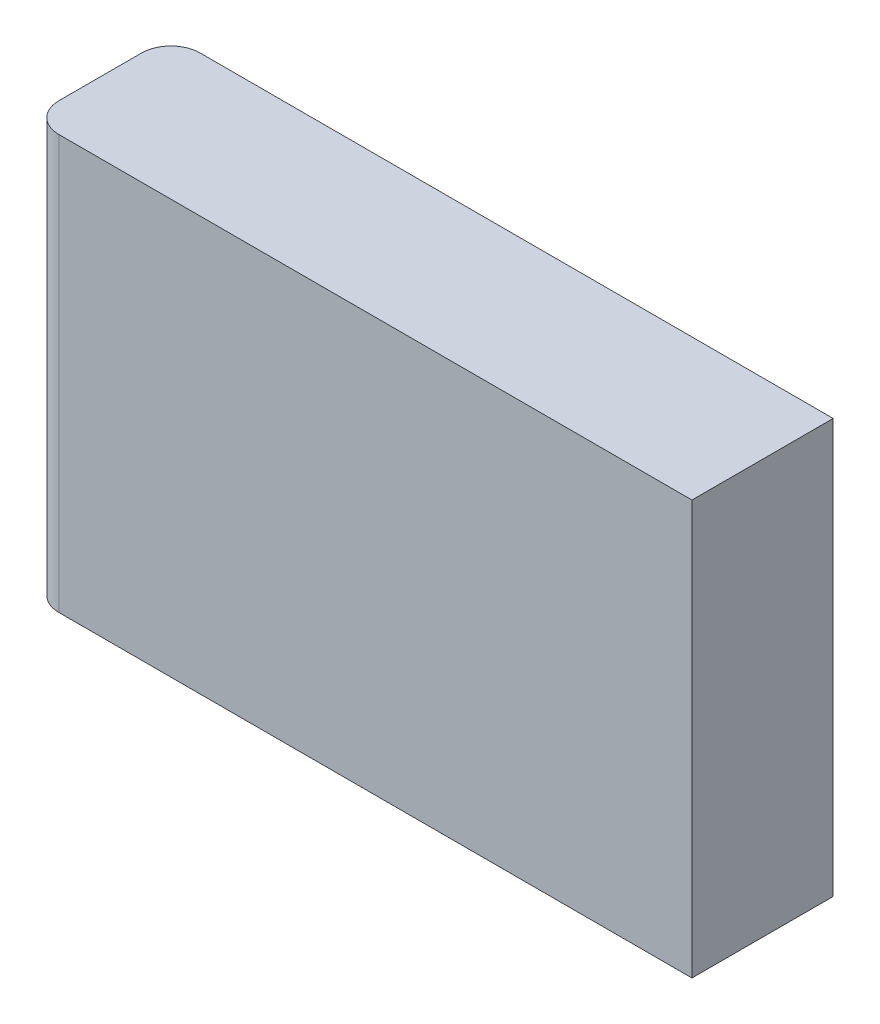
ISO-10303-21;
HEADER;
FILE_DESCRIPTION(('STEP AP214'),'2;1');
FILE_NAME('part.step','',(''),(''),'','','');
FILE_SCHEMA(('AUTOMOTIVE_DESIGN { 1 0 10303 214 1 1 1 1 }'));
ENDSEC;
DATA;
#1=APPLICATION_CONTEXT('core data for automotive mechanical design processes');
#2=APPLICATION_PROTOCOL_DEFINITION('international standard','automotive_design',2000,#1);
#3=PRODUCT_CONTEXT('',#1,'mechanical');
#4=PRODUCT('Part','Part','',(#3));
#5=PRODUCT_RELATED_PRODUCT_CATEGORY('part','',(#4));
#6=PRODUCT_DEFINITION_FORMATION('','',#4);
#7=PRODUCT_DEFINITION_CONTEXT('part definition',#1,'design');
#8=PRODUCT_DEFINITION('design','',#6,#7);
#9=PRODUCT_DEFINITION_SHAPE('','',#8);
#10=(LENGTH_UNIT() NAMED_UNIT(*) SI_UNIT(.MILLI.,.METRE.));
#11=(NAMED_UNIT(*) PLANE_ANGLE_UNIT() SI_UNIT($,.RADIAN.));
#12=(NAMED_UNIT(*) SI_UNIT($,.STERADIAN.) SOLID_ANGLE_UNIT());
#13=UNCERTAINTY_MEASURE_WITH_UNIT(LENGTH_MEASURE(1.E-05),#10,'distance_accuracy_value','');
#14=(GEOMETRIC_REPRESENTATION_CONTEXT(3) GLOBAL_UNCERTAINTY_ASSIGNED_CONTEXT((#13)) GLOBAL_UNIT_ASSIGNED_CONTEXT((#10,
#11,#12)) REPRESENTATION_CONTEXT('',''));
#15=CARTESIAN_POINT('',(0.,0.,0.));
#16=DIRECTION('',(0.,0.,1.));
#17=DIRECTION('',(1.,0.,0.));
#18=AXIS2_PLACEMENT_3D('',#15,#16,#17);
#19=CARTESIAN_POINT('',(-68.,-42.5,29.));
#20=DIRECTION('',(1.,0.,0.));
#21=DIRECTION('',(0.,0.,-1.));
#22=AXIS2_PLACEMENT_3D('',#19,#20,#21);
#23=PLANE('',#22);
#24=DIRECTION('',(0.,0.,-1.));
#25=VECTOR('',#24,1.);
#26=CARTESIAN_POINT('',(-68.,42.5,29.));
#27=LINE('',#26,#25);
#28=CARTESIAN_POINT('',(-68.,42.5,23.));
#29=VERTEX_POINT('',#28);
#30=CARTESIAN_POINT('',(-68.,42.5,6.00000000000001));
#31=VERTEX_POINT('',#30);
#32=EDGE_CURVE('E112',#29,#31,#27,.T.);
#33=ORIENTED_EDGE('',*,*,#32,.T.);
#34=DIRECTION('',(0.,-1.,0.));
#35=VECTOR('',#34,1.);
#36=CARTESIAN_POINT('',(-68.,-42.5,6.));
#37=LINE('',#36,#35);
#38=CARTESIAN_POINT('',(-68.,-42.5,6.00000000000001));
#39=VERTEX_POINT('',#38);
#40=EDGE_CURVE('E125',#31,#39,#37,.T.);
#41=ORIENTED_EDGE('',*,*,#40,.T.);
#42=DIRECTION('',(0.,0.,-1.));
#43=VECTOR('',#42,1.);
#44=CARTESIAN_POINT('',(-68.,-42.5,29.));
#45=LINE('',#44,#43);
#46=CARTESIAN_POINT('',(-68.,-42.5,23.));
#47=VERTEX_POINT('',#46);
#48=EDGE_CURVE('E105',#47,#39,#45,.T.);
#49=ORIENTED_EDGE('',*,*,#48,.F.);
#50=DIRECTION('',(0.,-1.,0.));
#51=VECTOR('',#50,1.);
#52=CARTESIAN_POINT('',(-68.,42.5,23.));
#53=LINE('',#52,#51);
#54=EDGE_CURVE('E123',#47,#29,#53,.F.);
#55=ORIENTED_EDGE('',*,*,#54,.T.);
#56=EDGE_LOOP('',(#33,#41,#49,#55));
#57=FACE_BOUND('',#56,.T.);
#58=ADVANCED_FACE('F32',(#57),#23,.F.);
#59=CARTESIAN_POINT('',(68.,-42.5,29.));
#60=DIRECTION('',(0.,1.,0.));
#61=DIRECTION('',(-1.,0.,0.));
#62=AXIS2_PLACEMENT_3D('',#59,#60,#61);
#63=PLANE('',#62);
#64=ORIENTED_EDGE('',*,*,#48,.T.);
#65=CARTESIAN_POINT('',(-62.,-42.5,6.));
#66=DIRECTION('',(0.,1.,0.));
#67=DIRECTION('',(-1.,0.,0.));
#68=AXIS2_PLACEMENT_3D('',#65,#66,#67);
#69=CIRCLE('',#68,6.);
#70=CARTESIAN_POINT('',(-62.,-42.5,0.));
#71=VERTEX_POINT('',#70);
#72=EDGE_CURVE('E130',#39,#71,#69,.F.);
#73=ORIENTED_EDGE('',*,*,#72,.T.);
#74=DIRECTION('',(1.,0.,0.));
#75=VECTOR('',#74,1.);
#76=CARTESIAN_POINT('',(68.,-42.5,0.));
#77=LINE('',#76,#75);
#78=CARTESIAN_POINT('',(68.,-42.5,0.));
#79=VERTEX_POINT('',#78);
#80=EDGE_CURVE('E102',#71,#79,#77,.T.);
#81=ORIENTED_EDGE('',*,*,#80,.T.);
#82=DIRECTION('',(0.,0.,-1.));
#83=VECTOR('',#82,1.);
#84=CARTESIAN_POINT('',(68.,-42.5,29.));
#85=LINE('',#84,#83);
#86=CARTESIAN_POINT('',(68.,-42.5,29.));
#87=VERTEX_POINT('',#86);
#88=EDGE_CURVE('E99',#87,#79,#85,.T.);
#89=ORIENTED_EDGE('',*,*,#88,.F.);
#90=DIRECTION('',(1.,0.,0.));
#91=VECTOR('',#90,1.);
#92=CARTESIAN_POINT('',(68.,-42.5,29.));
#93=LINE('',#92,#91);
#94=CARTESIAN_POINT('',(-62.,-42.5,29.));
#95=VERTEX_POINT('',#94);
#96=EDGE_CURVE('E88',#95,#87,#93,.T.);
#97=ORIENTED_EDGE('',*,*,#96,.F.);
#98=CARTESIAN_POINT('',(-62.,-42.5,23.));
#99=DIRECTION('',(0.,1.,0.));
#100=DIRECTION('',(-1.,0.,0.));
#101=AXIS2_PLACEMENT_3D('',#98,#99,#100);
#102=CIRCLE('',#101,6.);
#103=EDGE_CURVE('E128',#95,#47,#102,.F.);
#104=ORIENTED_EDGE('',*,*,#103,.T.);
#105=EDGE_LOOP('',(#64,#73,#81,#89,#97,#104));
#106=FACE_BOUND('',#105,.T.);
#107=ADVANCED_FACE('F101',(#106),#63,.F.);
#108=CARTESIAN_POINT('',(68.,-42.5,29.));
#109=DIRECTION('',(-1.,0.,0.));
#110=DIRECTION('',(0.,0.,1.));
#111=AXIS2_PLACEMENT_3D('',#108,#109,#110);
#112=PLANE('',#111);
#113=DIRECTION('',(0.,1.,0.));
#114=VECTOR('',#113,1.);
#115=CARTESIAN_POINT('',(68.,-42.5,0.));
#116=LINE('',#115,#114);
#117=CARTESIAN_POINT('',(68.,42.5,0.));
#118=VERTEX_POINT('',#117);
#119=EDGE_CURVE('E116',#79,#118,#116,.T.);
#120=ORIENTED_EDGE('',*,*,#119,.T.);
#121=DIRECTION('',(0.,0.,-1.));
#122=VECTOR('',#121,1.);
#123=CARTESIAN_POINT('',(68.,42.5,29.));
#124=LINE('',#123,#122);
#125=CARTESIAN_POINT('',(68.,42.5,29.));
#126=VERTEX_POINT('',#125);
#127=EDGE_CURVE('E106',#126,#118,#124,.T.);
#128=ORIENTED_EDGE('',*,*,#127,.F.);
#129=DIRECTION('',(0.,1.,0.));
#130=VECTOR('',#129,1.);
#131=CARTESIAN_POINT('',(68.,-42.5,29.));
#132=LINE('',#131,#130);
#133=EDGE_CURVE('E92',#87,#126,#132,.T.);
#134=ORIENTED_EDGE('',*,*,#133,.F.);
#135=ORIENTED_EDGE('',*,*,#88,.T.);
#136=EDGE_LOOP('',(#120,#128,#134,#135));
#137=FACE_BOUND('',#136,.T.);
#138=ADVANCED_FACE('F108',(#137),#112,.F.);
#139=CARTESIAN_POINT('',(68.,42.5,29.));
#140=DIRECTION('',(0.,-1.,0.));
#141=DIRECTION('',(1.,0.,0.));
#142=AXIS2_PLACEMENT_3D('',#139,#140,#141);
#143=PLANE('',#142);
#144=DIRECTION('',(-1.,0.,0.));
#145=VECTOR('',#144,1.);
#146=CARTESIAN_POINT('',(68.,42.5,0.));
#147=LINE('',#146,#145);
#148=CARTESIAN_POINT('',(-62.,42.5,0.));
#149=VERTEX_POINT('',#148);
#150=EDGE_CURVE('E96',#118,#149,#147,.T.);
#151=ORIENTED_EDGE('',*,*,#150,.T.);
#152=CARTESIAN_POINT('',(-62.,42.5,6.));
#153=DIRECTION('',(0.,-1.,0.));
#154=DIRECTION('',(1.,0.,0.));
#155=AXIS2_PLACEMENT_3D('',#152,#153,#154);
#156=CIRCLE('',#155,6.);
#157=EDGE_CURVE('E40',#149,#31,#156,.F.);
#158=ORIENTED_EDGE('',*,*,#157,.T.);
#159=ORIENTED_EDGE('',*,*,#32,.F.);
#160=CARTESIAN_POINT('',(-62.,42.5,23.));
#161=DIRECTION('',(0.,-1.,0.));
#162=DIRECTION('',(1.,0.,0.));
#163=AXIS2_PLACEMENT_3D('',#160,#161,#162);
#164=CIRCLE('',#163,6.);
#165=CARTESIAN_POINT('',(-62.,42.5,29.));
#166=VERTEX_POINT('',#165);
#167=EDGE_CURVE('E47',#29,#166,#164,.F.);
#168=ORIENTED_EDGE('',*,*,#167,.T.);
#169=DIRECTION('',(-1.,0.,0.));
#170=VECTOR('',#169,1.);
#171=CARTESIAN_POINT('',(68.,42.5,29.));
#172=LINE('',#171,#170);
#173=EDGE_CURVE('E110',#126,#166,#172,.T.);
#174=ORIENTED_EDGE('',*,*,#173,.F.);
#175=ORIENTED_EDGE('',*,*,#127,.T.);
#176=EDGE_LOOP('',(#151,#158,#159,#168,#174,#175));
#177=FACE_BOUND('',#176,.T.);
#178=ADVANCED_FACE('F134',(#177),#143,.F.);
#179=CARTESIAN_POINT('',(0.,0.,29.));
#180=DIRECTION('',(0.,0.,1.));
#181=DIRECTION('',(1.,0.,0.));
#182=AXIS2_PLACEMENT_3D('',#179,#180,#181);
#183=PLANE('',#182);
#184=ORIENTED_EDGE('',*,*,#173,.T.);
#185=DIRECTION('',(0.,-1.,0.));
#186=VECTOR('',#185,1.);
#187=CARTESIAN_POINT('',(-62.,-42.5,29.));
#188=LINE('',#187,#186);
#189=EDGE_CURVE('E11',#166,#95,#188,.T.);
#190=ORIENTED_EDGE('',*,*,#189,.T.);
#191=ORIENTED_EDGE('',*,*,#96,.T.);
#192=ORIENTED_EDGE('',*,*,#133,.T.);
#193=EDGE_LOOP('',(#184,#190,#191,#192));
#194=FACE_BOUND('',#193,.T.);
#195=ADVANCED_FACE('F90',(#194),#183,.T.);
#196=CARTESIAN_POINT('',(0.,0.,0.));
#197=DIRECTION('',(0.,0.,1.));
#198=DIRECTION('',(1.,0.,0.));
#199=AXIS2_PLACEMENT_3D('',#196,#197,#198);
#200=PLANE('',#199);
#201=ORIENTED_EDGE('',*,*,#80,.F.);
#202=DIRECTION('',(0.,-1.,0.));
#203=VECTOR('',#202,1.);
#204=CARTESIAN_POINT('',(-62.,0.,0.));
#205=LINE('',#204,#203);
#206=EDGE_CURVE('E55',#71,#149,#205,.F.);
#207=ORIENTED_EDGE('',*,*,#206,.T.);
#208=ORIENTED_EDGE('',*,*,#150,.F.);
#209=ORIENTED_EDGE('',*,*,#119,.F.);
#210=EDGE_LOOP('',(#201,#207,#208,#209));
#211=FACE_BOUND('',#210,.T.);
#212=ADVANCED_FACE('F141',(#211),#200,.F.);
#213=CARTESIAN_POINT('',(-62.,-42.5,6.));
#214=DIRECTION('',(0.,-1.,0.));
#215=DIRECTION('',(0.,0.,-1.));
#216=AXIS2_PLACEMENT_3D('',#213,#214,#215);
#217=CYLINDRICAL_SURFACE('',#216,6.);
#218=ORIENTED_EDGE('',*,*,#157,.F.);
#219=ORIENTED_EDGE('',*,*,#206,.F.);
#220=ORIENTED_EDGE('',*,*,#72,.F.);
#221=ORIENTED_EDGE('',*,*,#40,.F.);
#222=EDGE_LOOP('',(#218,#219,#220,#221));
#223=FACE_BOUND('',#222,.T.);
#224=ADVANCED_FACE('F140',(#223),#217,.T.);
#225=CARTESIAN_POINT('',(-62.,0.,23.));
#226=DIRECTION('',(0.,1.,0.));
#227=DIRECTION('',(0.,0.,1.));
#228=AXIS2_PLACEMENT_3D('',#225,#226,#227);
#229=CYLINDRICAL_SURFACE('',#228,6.);
#230=ORIENTED_EDGE('',*,*,#167,.F.);
#231=ORIENTED_EDGE('',*,*,#54,.F.);
#232=ORIENTED_EDGE('',*,*,#103,.F.);
#233=ORIENTED_EDGE('',*,*,#189,.F.);
#234=EDGE_LOOP('',(#230,#231,#232,#233));
#235=FACE_BOUND('',#234,.T.);
#236=ADVANCED_FACE('F34',(#235),#229,.T.);
#237=CLOSED_SHELL('',(#58,#107,#138,#178,#195,#212,#224,#236));
#238=MANIFOLD_SOLID_BREP('B2',#237);
#239=ADVANCED_BREP_SHAPE_REPRESENTATION('',(#18,#238),#14);
#240=SHAPE_DEFINITION_REPRESENTATION(#9,#239);
ENDSEC;
END-ISO-10303-21;
